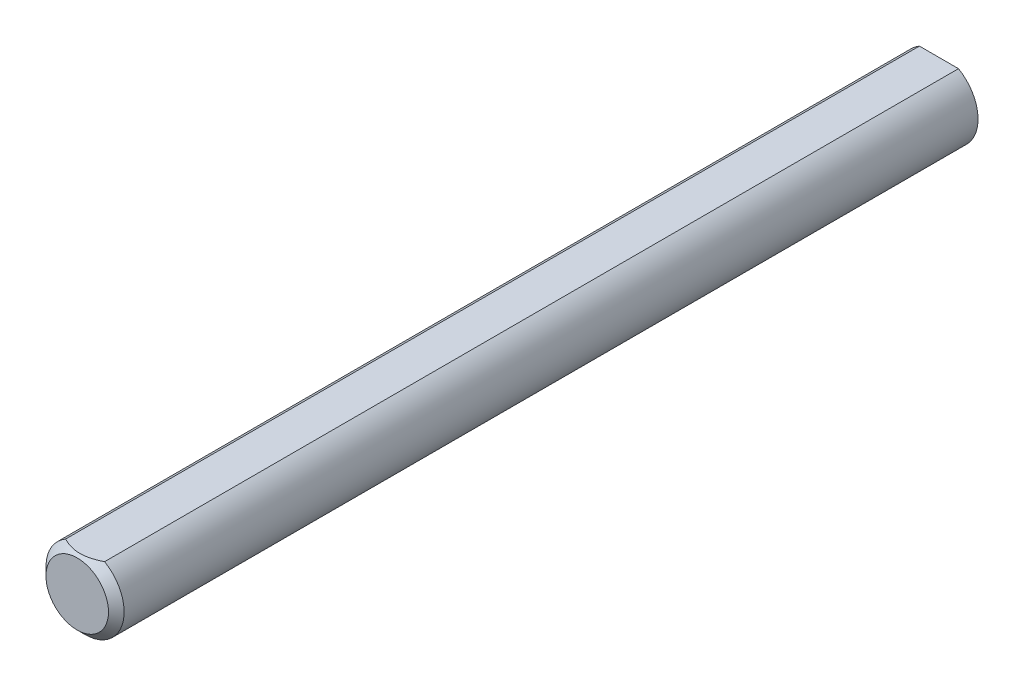
ISO-10303-21;
HEADER;
FILE_DESCRIPTION(('STEP AP214'),'2;1');
FILE_NAME('part.step','',(''),(''),'','','');
FILE_SCHEMA(('AUTOMOTIVE_DESIGN { 1 0 10303 214 1 1 1 1 }'));
ENDSEC;
DATA;
#1=APPLICATION_CONTEXT('core data for automotive mechanical design processes');
#2=APPLICATION_PROTOCOL_DEFINITION('international standard','automotive_design',2000,#1);
#3=PRODUCT_CONTEXT('',#1,'mechanical');
#4=PRODUCT('Part','Part','',(#3));
#5=PRODUCT_RELATED_PRODUCT_CATEGORY('part','',(#4));
#6=PRODUCT_DEFINITION_FORMATION('','',#4);
#7=PRODUCT_DEFINITION_CONTEXT('part definition',#1,'design');
#8=PRODUCT_DEFINITION('design','',#6,#7);
#9=PRODUCT_DEFINITION_SHAPE('','',#8);
#10=(LENGTH_UNIT() NAMED_UNIT(*) SI_UNIT(.MILLI.,.METRE.));
#11=(NAMED_UNIT(*) PLANE_ANGLE_UNIT() SI_UNIT($,.RADIAN.));
#12=(NAMED_UNIT(*) SI_UNIT($,.STERADIAN.) SOLID_ANGLE_UNIT());
#13=UNCERTAINTY_MEASURE_WITH_UNIT(LENGTH_MEASURE(1.E-05),#10,'distance_accuracy_value','');
#14=(GEOMETRIC_REPRESENTATION_CONTEXT(3) GLOBAL_UNCERTAINTY_ASSIGNED_CONTEXT((#13)) GLOBAL_UNIT_ASSIGNED_CONTEXT((#10,
#11,#12)) REPRESENTATION_CONTEXT('',''));
#15=CARTESIAN_POINT('',(0.,0.,0.));
#16=DIRECTION('',(0.,0.,1.));
#17=DIRECTION('',(1.,0.,0.));
#18=AXIS2_PLACEMENT_3D('',#15,#16,#17);
#19=CARTESIAN_POINT('',(0.,0.,76.2));
#20=DIRECTION('',(0.,0.,-1.));
#21=DIRECTION('',(-1.,0.,0.));
#22=AXIS2_PLACEMENT_3D('',#19,#20,#21);
#23=CYLINDRICAL_SURFACE('',#22,3.175);
#24=CARTESIAN_POINT('',(0.,0.,6.2));
#25=DIRECTION('',(0.,0.,-1.));
#26=DIRECTION('',(-1.,0.,0.));
#27=AXIS2_PLACEMENT_3D('',#24,#25,#26);
#28=CIRCLE('',#27,3.175);
#29=CARTESIAN_POINT('',(1.5875,2.74963065701559,6.2));
#30=VERTEX_POINT('',#29);
#31=CARTESIAN_POINT('',(-1.5875,2.74963065701559,6.19999999999997));
#32=VERTEX_POINT('',#31);
#33=EDGE_CURVE('E54',#30,#32,#28,.T.);
#34=ORIENTED_EDGE('',*,*,#33,.F.);
#35=DIRECTION('',(0.,0.,1.));
#36=VECTOR('',#35,1.);
#37=CARTESIAN_POINT('',(1.5875,2.74963065701559,-76.2));
#38=LINE('',#37,#36);
#39=CARTESIAN_POINT('',(1.5875,2.74963065701559,75.5650000000001));
#40=VERTEX_POINT('',#39);
#41=EDGE_CURVE('E71',#30,#40,#38,.T.);
#42=ORIENTED_EDGE('',*,*,#41,.T.);
#43=CARTESIAN_POINT('',(0.,0.,75.5650000000001));
#44=DIRECTION('',(0.,0.,1.));
#45=DIRECTION('',(1.,0.,0.));
#46=AXIS2_PLACEMENT_3D('',#43,#44,#45);
#47=CIRCLE('',#46,3.175);
#48=CARTESIAN_POINT('',(-1.5875,2.74963065701559,75.5650000000001));
#49=VERTEX_POINT('',#48);
#50=EDGE_CURVE('E77',#40,#49,#47,.F.);
#51=ORIENTED_EDGE('',*,*,#50,.T.);
#52=DIRECTION('',(0.,0.,1.));
#53=VECTOR('',#52,1.);
#54=CARTESIAN_POINT('',(-1.5875,2.74963065701559,-76.2));
#55=LINE('',#54,#53);
#56=EDGE_CURVE('E61',#32,#49,#55,.T.);
#57=ORIENTED_EDGE('',*,*,#56,.F.);
#58=EDGE_LOOP('',(#34,#42,#51,#57));
#59=FACE_BOUND('',#58,.T.);
#60=ADVANCED_FACE('F39',(#59),#23,.T.);
#61=CARTESIAN_POINT('',(-1.5875,2.74963065701559,-76.2));
#62=DIRECTION('',(0.,-1.,0.));
#63=DIRECTION('',(0.,0.,-1.));
#64=AXIS2_PLACEMENT_3D('',#61,#62,#63);
#65=PLANE('',#64);
#66=DIRECTION('',(1.,0.,0.));
#67=VECTOR('',#66,1.);
#68=CARTESIAN_POINT('',(-1.5875,2.74963065701559,6.2));
#69=LINE('',#68,#67);
#70=EDGE_CURVE('E11',#32,#30,#69,.T.);
#71=ORIENTED_EDGE('',*,*,#70,.F.);
#72=ORIENTED_EDGE('',*,*,#56,.T.);
#73=CARTESIAN_POINT('',(-3.22896135223734,2.74963065701559,74.4989317189838));
#74=CARTESIAN_POINT('',(-3.15061649550109,2.74963065701559,74.5585665245461));
#75=CARTESIAN_POINT('',(-3.07184009651267,2.74963065701559,74.6176434820251));
#76=CARTESIAN_POINT('',(-2.91325130568822,2.74963065701559,74.7344297176184));
#77=CARTESIAN_POINT('',(-2.83343866506298,2.74963065701559,74.7921386575259));
#78=CARTESIAN_POINT('',(-2.6720206285275,2.74963065701559,74.9063475478052));
#79=CARTESIAN_POINT('',(-2.59040613970432,2.74963065701559,74.9628346895372));
#80=CARTESIAN_POINT('',(-2.42580311622166,2.74963065701559,75.0737635143345));
#81=CARTESIAN_POINT('',(-2.34281467809337,2.74963065701559,75.1282053402286));
#82=CARTESIAN_POINT('',(-2.17021447787231,2.74963065701559,75.2377738711657));
#83=CARTESIAN_POINT('',(-2.08050398524195,2.74963065701559,75.2927458353403));
#84=CARTESIAN_POINT('',(-1.89900904678693,2.74963065701559,75.3991469931979));
#85=CARTESIAN_POINT('',(-1.80722487525637,2.74963065701559,75.450576651835));
#86=CARTESIAN_POINT('',(-1.62153760368931,2.74963065701559,75.5488148050515));
#87=CARTESIAN_POINT('',(-1.52764140922495,2.74963065701559,75.5956362501768));
#88=CARTESIAN_POINT('',(-1.33724706572101,2.74963065701559,75.6836008153408));
#89=CARTESIAN_POINT('',(-1.24075014112709,2.74963065701559,75.7247465535943));
#90=CARTESIAN_POINT('',(-1.0536474276075,2.74963065701559,75.7965564372306));
#91=CARTESIAN_POINT('',(-0.963276425588651,2.74963065701559,75.8278260439733));
#92=CARTESIAN_POINT('',(-0.780303735161114,2.74963065701559,75.8831231873505));
#93=CARTESIAN_POINT('',(-0.68770189877947,2.74963065701559,75.9071502421447));
#94=CARTESIAN_POINT('',(-0.502391431282856,2.74963065701559,75.9462882908412));
#95=CARTESIAN_POINT('',(-0.409716445146758,2.74963065701559,75.961555954749));
#96=CARTESIAN_POINT('',(-0.223306330685266,2.74963065701559,75.9828688420295));
#97=CARTESIAN_POINT('',(-0.129571403437367,2.74963065701559,75.9889157860142));
#98=CARTESIAN_POINT('',(0.0543357559016806,2.74963065701559,75.9913094852486));
#99=CARTESIAN_POINT('',(0.144503242552371,2.74963065701559,75.9880280862279));
#100=CARTESIAN_POINT('',(0.324095543573417,2.74963065701559,75.9727817719639));
#101=CARTESIAN_POINT('',(0.413520286896872,2.74963065701559,75.9608160354815));
#102=CARTESIAN_POINT('',(0.592496066024079,2.74963065701559,75.9286615235362));
#103=CARTESIAN_POINT('',(0.682021177379025,2.74963065701559,75.9083305801753));
#104=CARTESIAN_POINT('',(0.859103373963831,2.74963065701559,75.860545197954));
#105=CARTESIAN_POINT('',(0.946660601088792,2.74963065701559,75.8330912745013));
#106=CARTESIAN_POINT('',(1.21954622680464,2.74963065701559,75.7371294821898));
#107=CARTESIAN_POINT('',(1.40108594012667,2.74963065701559,75.6578094527364));
#108=CARTESIAN_POINT('',(1.66675889489862,2.74963065701559,75.5255539852258));
#109=CARTESIAN_POINT('',(1.7543748838502,2.74963065701559,75.4791526611239));
#110=CARTESIAN_POINT('',(1.92761951465604,2.74963065701559,75.3827692377678));
#111=CARTESIAN_POINT('',(2.0132485070546,2.74963065701559,75.3327877765757));
#112=CARTESIAN_POINT('',(2.1785518428574,2.74963065701559,75.2325138433062));
#113=CARTESIAN_POINT('',(2.25831097248805,2.74963065701559,75.1823595590397));
#114=CARTESIAN_POINT('',(2.41646118640002,2.74963065701559,75.0799282177626));
#115=CARTESIAN_POINT('',(2.49485216688183,2.74963065701559,75.0276510006806));
#116=CARTESIAN_POINT('',(2.64980987258634,2.74963065701559,74.9217831250555));
#117=CARTESIAN_POINT('',(2.72638621983964,2.74963065701559,74.8682064917739));
#118=CARTESIAN_POINT('',(2.87849044969172,2.74963065701559,74.759627090017));
#119=CARTESIAN_POINT('',(2.95401861519267,2.74963065701559,74.7046247183091));
#120=CARTESIAN_POINT('',(3.02910770969629,2.74963065701559,74.6490389555826));
#121=B_SPLINE_CURVE_WITH_KNOTS('',3,(#73,#74,#75,#76,#77,#78,#79,#80,#81,#82,#83,#84,#85,#86,
#87,#88,#89,#90,#91,#92,#93,#94,#95,#96,#97,#98,#99,#100,#101,#102,#103,#104,#105,#106,#107,
#108,#109,#110,#111,#112,#113,#114,#115,#116,#117,#118,#119,#120),.UNSPECIFIED.,.F.,.F.,(4,2,2,
2,2,2,2,2,2,2,2,2,2,2,2,2,2,2,2,2,2,2,2,4),(0.,0.295383449271204,0.590839178498794,
0.888580871622965,1.18630173399071,1.50187785569758,1.81741247644349,2.13203338294824,
2.44650866534178,2.73314264689638,3.01979569373836,3.30114758261628,3.5824469640203,
3.85269226293498,4.12296312107192,4.39803055604403,4.67307809311876,5.26557071241318,
5.56297998480388,5.86033638333474,6.14295523590886,6.42559543796932,6.70595195130127,
6.98623126477273),.UNSPECIFIED.);
#122=EDGE_CURVE('E49',#49,#40,#121,.T.);
#123=ORIENTED_EDGE('',*,*,#122,.T.);
#124=ORIENTED_EDGE('',*,*,#41,.F.);
#125=EDGE_LOOP('',(#71,#72,#123,#124));
#126=FACE_BOUND('',#125,.T.);
#127=ADVANCED_FACE('F74',(#126),#65,.F.);
#128=CARTESIAN_POINT('',(0.,0.,76.2));
#129=DIRECTION('',(0.,0.,1.));
#130=DIRECTION('',(1.,0.,0.));
#131=AXIS2_PLACEMENT_3D('',#128,#129,#130);
#132=PLANE('',#131);
#133=CARTESIAN_POINT('',(0.,0.,76.2));
#134=DIRECTION('',(0.,0.,1.));
#135=DIRECTION('',(1.,0.,0.));
#136=AXIS2_PLACEMENT_3D('',#133,#134,#135);
#137=CIRCLE('',#136,2.54000000000008);
#138=CARTESIAN_POINT('',(2.54000000000008,0.,76.2));
#139=VERTEX_POINT('',#138);
#140=EDGE_CURVE('E81',#139,#139,#137,.T.);
#141=ORIENTED_EDGE('',*,*,#140,.T.);
#142=EDGE_LOOP('',(#141));
#143=FACE_BOUND('',#142,.T.);
#144=ADVANCED_FACE('F97',(#143),#132,.T.);
#145=CARTESIAN_POINT('',(0.,0.,76.2));
#146=DIRECTION('',(0.,0.,-1.));
#147=DIRECTION('',(-1.,0.,0.));
#148=AXIS2_PLACEMENT_3D('',#145,#146,#147);
#149=CONICAL_SURFACE('',#148,2.54000000000008,0.785398163397452);
#150=ORIENTED_EDGE('',*,*,#122,.F.);
#151=ORIENTED_EDGE('',*,*,#50,.F.);
#152=EDGE_LOOP('',(#150,#151));
#153=FACE_BOUND('',#152,.T.);
#154=ORIENTED_EDGE('',*,*,#140,.F.);
#155=EDGE_LOOP('',(#154));
#156=FACE_BOUND('',#155,.T.);
#157=ADVANCED_FACE('F41',(#153,#156),#149,.T.);
#158=CARTESIAN_POINT('',(0.,0.,6.2));
#159=DIRECTION('',(0.,0.,-1.));
#160=DIRECTION('',(-1.,0.,0.));
#161=AXIS2_PLACEMENT_3D('',#158,#159,#160);
#162=PLANE('',#161);
#163=ORIENTED_EDGE('',*,*,#70,.T.);
#164=ORIENTED_EDGE('',*,*,#33,.T.);
#165=EDGE_LOOP('',(#163,#164));
#166=FACE_BOUND('',#165,.T.);
#167=ADVANCED_FACE('F67',(#166),#162,.T.);
#168=CLOSED_SHELL('',(#60,#127,#144,#157,#167));
#169=MANIFOLD_SOLID_BREP('B2',#168);
#170=ADVANCED_BREP_SHAPE_REPRESENTATION('',(#18,#169),#14);
#171=SHAPE_DEFINITION_REPRESENTATION(#9,#170);
ENDSEC;
END-ISO-10303-21;
